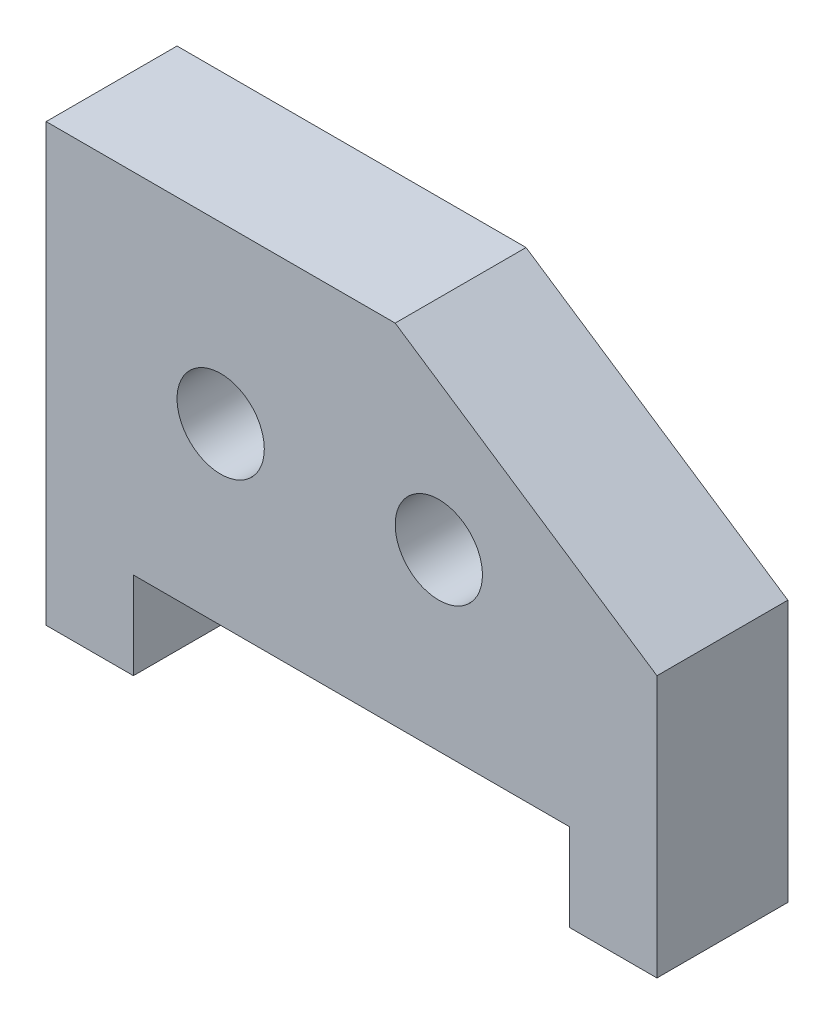
ISO-10303-21;
HEADER;
FILE_DESCRIPTION(('STEP AP214'),'2;1');
FILE_NAME('part.step','',(''),(''),'','','');
FILE_SCHEMA(('AUTOMOTIVE_DESIGN { 1 0 10303 214 1 1 1 1 }'));
ENDSEC;
DATA;
#1=APPLICATION_CONTEXT('core data for automotive mechanical design processes');
#2=APPLICATION_PROTOCOL_DEFINITION('international standard','automotive_design',2000,#1);
#3=PRODUCT_CONTEXT('',#1,'mechanical');
#4=PRODUCT('Part','Part','',(#3));
#5=PRODUCT_RELATED_PRODUCT_CATEGORY('part','',(#4));
#6=PRODUCT_DEFINITION_FORMATION('','',#4);
#7=PRODUCT_DEFINITION_CONTEXT('part definition',#1,'design');
#8=PRODUCT_DEFINITION('design','',#6,#7);
#9=PRODUCT_DEFINITION_SHAPE('','',#8);
#10=(LENGTH_UNIT() NAMED_UNIT(*) SI_UNIT(.MILLI.,.METRE.));
#11=(NAMED_UNIT(*) PLANE_ANGLE_UNIT() SI_UNIT($,.RADIAN.));
#12=(NAMED_UNIT(*) SI_UNIT($,.STERADIAN.) SOLID_ANGLE_UNIT());
#13=UNCERTAINTY_MEASURE_WITH_UNIT(LENGTH_MEASURE(1.E-05),#10,'distance_accuracy_value','');
#14=(GEOMETRIC_REPRESENTATION_CONTEXT(3) GLOBAL_UNCERTAINTY_ASSIGNED_CONTEXT((#13)) GLOBAL_UNIT_ASSIGNED_CONTEXT((#10,
#11,#12)) REPRESENTATION_CONTEXT('',''));
#15=CARTESIAN_POINT('',(0.,0.,0.));
#16=DIRECTION('',(0.,0.,1.));
#17=DIRECTION('',(1.,0.,0.));
#18=AXIS2_PLACEMENT_3D('',#15,#16,#17);
#19=CARTESIAN_POINT('',(0.,0.,75.));
#20=DIRECTION('',(0.,0.,1.));
#21=DIRECTION('',(1.,0.,0.));
#22=AXIS2_PLACEMENT_3D('',#19,#20,#21);
#23=PLANE('',#22);
#24=CARTESIAN_POINT('',(79.1666666666666,4.16666666666664,75.));
#25=DIRECTION('',(0.,0.,1.));
#26=DIRECTION('',(1.,0.,0.));
#27=AXIS2_PLACEMENT_3D('',#24,#25,#26);
#28=CIRCLE('',#27,25.);
#29=CARTESIAN_POINT('',(104.166666666667,4.16666666666664,75.));
#30=VERTEX_POINT('',#29);
#31=EDGE_CURVE('E140',#30,#30,#28,.T.);
#32=ORIENTED_EDGE('',*,*,#31,.F.);
#33=EDGE_LOOP('',(#32));
#34=FACE_BOUND('',#33,.T.);
#35=DIRECTION('',(1.,0.,0.));
#36=VECTOR('',#35,1.);
#37=CARTESIAN_POINT('',(154.166666666667,-145.833333333333,75.));
#38=LINE('',#37,#36);
#39=CARTESIAN_POINT('',(154.166666666667,-145.833333333333,75.));
#40=VERTEX_POINT('',#39);
#41=CARTESIAN_POINT('',(204.166666666667,-145.833333333333,75.));
#42=VERTEX_POINT('',#41);
#43=EDGE_CURVE('E153',#40,#42,#38,.T.);
#44=ORIENTED_EDGE('',*,*,#43,.T.);
#45=DIRECTION('',(0.,1.,0.));
#46=VECTOR('',#45,1.);
#47=CARTESIAN_POINT('',(204.166666666667,-145.833333333333,75.));
#48=LINE('',#47,#46);
#49=CARTESIAN_POINT('',(204.166666666667,4.16666666666668,75.));
#50=VERTEX_POINT('',#49);
#51=EDGE_CURVE('E96',#42,#50,#48,.T.);
#52=ORIENTED_EDGE('',*,*,#51,.T.);
#53=DIRECTION('',(-0.832050294337844,0.554700196225229,0.));
#54=VECTOR('',#53,1.);
#55=CARTESIAN_POINT('',(54.1666666666666,104.166666666667,75.));
#56=LINE('',#55,#54);
#57=CARTESIAN_POINT('',(54.1666666666666,104.166666666667,75.));
#58=VERTEX_POINT('',#57);
#59=EDGE_CURVE('E171',#50,#58,#56,.T.);
#60=ORIENTED_EDGE('',*,*,#59,.T.);
#61=DIRECTION('',(-1.,0.,0.));
#62=VECTOR('',#61,1.);
#63=CARTESIAN_POINT('',(-145.833333333333,104.166666666667,75.));
#64=LINE('',#63,#62);
#65=CARTESIAN_POINT('',(-145.833333333333,104.166666666667,75.));
#66=VERTEX_POINT('',#65);
#67=EDGE_CURVE('E188',#58,#66,#64,.T.);
#68=ORIENTED_EDGE('',*,*,#67,.T.);
#69=DIRECTION('',(0.,-1.,0.));
#70=VECTOR('',#69,1.);
#71=CARTESIAN_POINT('',(-145.833333333333,-145.833333333333,75.));
#72=LINE('',#71,#70);
#73=CARTESIAN_POINT('',(-145.833333333333,-145.833333333333,75.));
#74=VERTEX_POINT('',#73);
#75=EDGE_CURVE('E187',#66,#74,#72,.T.);
#76=ORIENTED_EDGE('',*,*,#75,.T.);
#77=DIRECTION('',(1.,0.,0.));
#78=VECTOR('',#77,1.);
#79=CARTESIAN_POINT('',(-145.833333333333,-145.833333333333,75.));
#80=LINE('',#79,#78);
#81=CARTESIAN_POINT('',(-95.8333333333335,-145.833333333333,75.));
#82=VERTEX_POINT('',#81);
#83=EDGE_CURVE('E118',#74,#82,#80,.T.);
#84=ORIENTED_EDGE('',*,*,#83,.T.);
#85=DIRECTION('',(0.,1.,0.));
#86=VECTOR('',#85,1.);
#87=CARTESIAN_POINT('',(-95.8333333333334,-95.8333333333334,75.));
#88=LINE('',#87,#86);
#89=CARTESIAN_POINT('',(-95.8333333333334,-95.8333333333334,75.));
#90=VERTEX_POINT('',#89);
#91=EDGE_CURVE('E112',#82,#90,#88,.T.);
#92=ORIENTED_EDGE('',*,*,#91,.T.);
#93=DIRECTION('',(1.,0.,0.));
#94=VECTOR('',#93,1.);
#95=CARTESIAN_POINT('',(154.166666666667,-95.8333333333333,75.));
#96=LINE('',#95,#94);
#97=CARTESIAN_POINT('',(154.166666666667,-95.8333333333333,75.));
#98=VERTEX_POINT('',#97);
#99=EDGE_CURVE('E116',#90,#98,#96,.T.);
#100=ORIENTED_EDGE('',*,*,#99,.T.);
#101=DIRECTION('',(0.,-1.,0.));
#102=VECTOR('',#101,1.);
#103=CARTESIAN_POINT('',(154.166666666667,-145.833333333333,75.));
#104=LINE('',#103,#102);
#105=EDGE_CURVE('E50',#98,#40,#104,.T.);
#106=ORIENTED_EDGE('',*,*,#105,.T.);
#107=EDGE_LOOP('',(#44,#52,#60,#68,#76,#84,#92,#100,#106));
#108=FACE_BOUND('',#107,.T.);
#109=CARTESIAN_POINT('',(-45.8333333333334,4.16666666666665,75.));
#110=DIRECTION('',(0.,0.,1.));
#111=DIRECTION('',(1.,0.,0.));
#112=AXIS2_PLACEMENT_3D('',#109,#110,#111);
#113=CIRCLE('',#112,25.);
#114=CARTESIAN_POINT('',(-20.8333333333334,4.16666666666665,75.));
#115=VERTEX_POINT('',#114);
#116=EDGE_CURVE('E198',#115,#115,#113,.T.);
#117=ORIENTED_EDGE('',*,*,#116,.F.);
#118=EDGE_LOOP('',(#117));
#119=FACE_BOUND('',#118,.T.);
#120=ADVANCED_FACE('F33',(#34,#108,#119),#23,.T.);
#121=CARTESIAN_POINT('',(0.,0.,0.));
#122=DIRECTION('',(0.,0.,1.));
#123=DIRECTION('',(1.,0.,0.));
#124=AXIS2_PLACEMENT_3D('',#121,#122,#123);
#125=PLANE('',#124);
#126=DIRECTION('',(1.,0.,0.));
#127=VECTOR('',#126,1.);
#128=CARTESIAN_POINT('',(154.166666666667,-145.833333333333,0.));
#129=LINE('',#128,#127);
#130=CARTESIAN_POINT('',(154.166666666667,-145.833333333333,0.));
#131=VERTEX_POINT('',#130);
#132=CARTESIAN_POINT('',(204.166666666667,-145.833333333333,0.));
#133=VERTEX_POINT('',#132);
#134=EDGE_CURVE('E136',#131,#133,#129,.T.);
#135=ORIENTED_EDGE('',*,*,#134,.F.);
#136=DIRECTION('',(0.,-1.,0.));
#137=VECTOR('',#136,1.);
#138=CARTESIAN_POINT('',(154.166666666667,-145.833333333333,0.));
#139=LINE('',#138,#137);
#140=CARTESIAN_POINT('',(154.166666666667,-95.8333333333333,0.));
#141=VERTEX_POINT('',#140);
#142=EDGE_CURVE('E88',#141,#131,#139,.T.);
#143=ORIENTED_EDGE('',*,*,#142,.F.);
#144=DIRECTION('',(1.,0.,0.));
#145=VECTOR('',#144,1.);
#146=CARTESIAN_POINT('',(154.166666666667,-95.8333333333333,0.));
#147=LINE('',#146,#145);
#148=CARTESIAN_POINT('',(-95.8333333333334,-95.8333333333334,0.));
#149=VERTEX_POINT('',#148);
#150=EDGE_CURVE('E82',#149,#141,#147,.T.);
#151=ORIENTED_EDGE('',*,*,#150,.F.);
#152=DIRECTION('',(0.,1.,0.));
#153=VECTOR('',#152,1.);
#154=CARTESIAN_POINT('',(-95.8333333333334,-95.8333333333334,0.));
#155=LINE('',#154,#153);
#156=CARTESIAN_POINT('',(-95.8333333333335,-145.833333333333,0.));
#157=VERTEX_POINT('',#156);
#158=EDGE_CURVE('E126',#157,#149,#155,.T.);
#159=ORIENTED_EDGE('',*,*,#158,.F.);
#160=DIRECTION('',(1.,0.,0.));
#161=VECTOR('',#160,1.);
#162=CARTESIAN_POINT('',(-145.833333333333,-145.833333333333,0.));
#163=LINE('',#162,#161);
#164=CARTESIAN_POINT('',(-145.833333333333,-145.833333333333,0.));
#165=VERTEX_POINT('',#164);
#166=EDGE_CURVE('E148',#165,#157,#163,.T.);
#167=ORIENTED_EDGE('',*,*,#166,.F.);
#168=DIRECTION('',(0.,-1.,0.));
#169=VECTOR('',#168,1.);
#170=CARTESIAN_POINT('',(-145.833333333333,-145.833333333333,0.));
#171=LINE('',#170,#169);
#172=CARTESIAN_POINT('',(-145.833333333333,104.166666666667,0.));
#173=VERTEX_POINT('',#172);
#174=EDGE_CURVE('E146',#173,#165,#171,.T.);
#175=ORIENTED_EDGE('',*,*,#174,.F.);
#176=DIRECTION('',(-1.,0.,0.));
#177=VECTOR('',#176,1.);
#178=CARTESIAN_POINT('',(-145.833333333333,104.166666666667,0.));
#179=LINE('',#178,#177);
#180=CARTESIAN_POINT('',(54.1666666666666,104.166666666667,0.));
#181=VERTEX_POINT('',#180);
#182=EDGE_CURVE('E144',#181,#173,#179,.T.);
#183=ORIENTED_EDGE('',*,*,#182,.F.);
#184=DIRECTION('',(-0.832050294337844,0.554700196225229,0.));
#185=VECTOR('',#184,1.);
#186=CARTESIAN_POINT('',(54.1666666666666,104.166666666667,0.));
#187=LINE('',#186,#185);
#188=CARTESIAN_POINT('',(204.166666666667,4.16666666666668,0.));
#189=VERTEX_POINT('',#188);
#190=EDGE_CURVE('E142',#189,#181,#187,.T.);
#191=ORIENTED_EDGE('',*,*,#190,.F.);
#192=DIRECTION('',(0.,1.,0.));
#193=VECTOR('',#192,1.);
#194=CARTESIAN_POINT('',(204.166666666667,-145.833333333333,0.));
#195=LINE('',#194,#193);
#196=EDGE_CURVE('E139',#133,#189,#195,.T.);
#197=ORIENTED_EDGE('',*,*,#196,.F.);
#198=EDGE_LOOP('',(#135,#143,#151,#159,#167,#175,#183,#191,#197));
#199=FACE_BOUND('',#198,.T.);
#200=CARTESIAN_POINT('',(79.1666666666666,4.16666666666664,0.));
#201=DIRECTION('',(0.,0.,1.));
#202=DIRECTION('',(1.,0.,0.));
#203=AXIS2_PLACEMENT_3D('',#200,#201,#202);
#204=CIRCLE('',#203,25.);
#205=CARTESIAN_POINT('',(104.166666666667,4.16666666666664,0.));
#206=VERTEX_POINT('',#205);
#207=EDGE_CURVE('E195',#206,#206,#204,.T.);
#208=ORIENTED_EDGE('',*,*,#207,.T.);
#209=EDGE_LOOP('',(#208));
#210=FACE_BOUND('',#209,.T.);
#211=CARTESIAN_POINT('',(-45.8333333333334,4.16666666666665,0.));
#212=DIRECTION('',(0.,0.,1.));
#213=DIRECTION('',(1.,0.,0.));
#214=AXIS2_PLACEMENT_3D('',#211,#212,#213);
#215=CIRCLE('',#214,25.);
#216=CARTESIAN_POINT('',(-20.8333333333334,4.16666666666665,0.));
#217=VERTEX_POINT('',#216);
#218=EDGE_CURVE('E201',#217,#217,#215,.T.);
#219=ORIENTED_EDGE('',*,*,#218,.T.);
#220=EDGE_LOOP('',(#219));
#221=FACE_BOUND('',#220,.T.);
#222=ADVANCED_FACE('F175',(#199,#210,#221),#125,.F.);
#223=CARTESIAN_POINT('',(154.166666666667,-145.833333333333,75.));
#224=DIRECTION('',(0.,1.,0.));
#225=DIRECTION('',(0.,0.,1.));
#226=AXIS2_PLACEMENT_3D('',#223,#224,#225);
#227=PLANE('',#226);
#228=ORIENTED_EDGE('',*,*,#134,.T.);
#229=DIRECTION('',(0.,0.,-1.));
#230=VECTOR('',#229,1.);
#231=CARTESIAN_POINT('',(204.166666666667,-145.833333333333,75.));
#232=LINE('',#231,#230);
#233=EDGE_CURVE('E11',#42,#133,#232,.T.);
#234=ORIENTED_EDGE('',*,*,#233,.F.);
#235=ORIENTED_EDGE('',*,*,#43,.F.);
#236=DIRECTION('',(0.,0.,-1.));
#237=VECTOR('',#236,1.);
#238=CARTESIAN_POINT('',(154.166666666667,-145.833333333333,75.));
#239=LINE('',#238,#237);
#240=EDGE_CURVE('E132',#40,#131,#239,.T.);
#241=ORIENTED_EDGE('',*,*,#240,.T.);
#242=EDGE_LOOP('',(#228,#234,#235,#241));
#243=FACE_BOUND('',#242,.T.);
#244=ADVANCED_FACE('F35',(#243),#227,.F.);
#245=CARTESIAN_POINT('',(204.166666666667,-145.833333333333,75.));
#246=DIRECTION('',(-1.,0.,0.));
#247=DIRECTION('',(0.,0.,1.));
#248=AXIS2_PLACEMENT_3D('',#245,#246,#247);
#249=PLANE('',#248);
#250=ORIENTED_EDGE('',*,*,#196,.T.);
#251=DIRECTION('',(0.,0.,-1.));
#252=VECTOR('',#251,1.);
#253=CARTESIAN_POINT('',(204.166666666667,4.16666666666668,75.));
#254=LINE('',#253,#252);
#255=EDGE_CURVE('E42',#50,#189,#254,.T.);
#256=ORIENTED_EDGE('',*,*,#255,.F.);
#257=ORIENTED_EDGE('',*,*,#51,.F.);
#258=ORIENTED_EDGE('',*,*,#233,.T.);
#259=EDGE_LOOP('',(#250,#256,#257,#258));
#260=FACE_BOUND('',#259,.T.);
#261=ADVANCED_FACE('F237',(#260),#249,.F.);
#262=CARTESIAN_POINT('',(54.1666666666666,104.166666666667,75.));
#263=DIRECTION('',(-0.554700196225229,-0.832050294337844,0.));
#264=DIRECTION('',(0.832050294337844,-0.554700196225229,0.));
#265=AXIS2_PLACEMENT_3D('',#262,#263,#264);
#266=PLANE('',#265);
#267=ORIENTED_EDGE('',*,*,#190,.T.);
#268=DIRECTION('',(0.,0.,-1.));
#269=VECTOR('',#268,1.);
#270=CARTESIAN_POINT('',(54.1666666666666,104.166666666667,75.));
#271=LINE('',#270,#269);
#272=EDGE_CURVE('E163',#58,#181,#271,.T.);
#273=ORIENTED_EDGE('',*,*,#272,.F.);
#274=ORIENTED_EDGE('',*,*,#59,.F.);
#275=ORIENTED_EDGE('',*,*,#255,.T.);
#276=EDGE_LOOP('',(#267,#273,#274,#275));
#277=FACE_BOUND('',#276,.T.);
#278=ADVANCED_FACE('F169',(#277),#266,.F.);
#279=CARTESIAN_POINT('',(-145.833333333333,104.166666666667,75.));
#280=DIRECTION('',(0.,-1.,0.));
#281=DIRECTION('',(0.,0.,-1.));
#282=AXIS2_PLACEMENT_3D('',#279,#280,#281);
#283=PLANE('',#282);
#284=ORIENTED_EDGE('',*,*,#182,.T.);
#285=DIRECTION('',(0.,0.,-1.));
#286=VECTOR('',#285,1.);
#287=CARTESIAN_POINT('',(-145.833333333333,104.166666666667,75.));
#288=LINE('',#287,#286);
#289=EDGE_CURVE('E160',#66,#173,#288,.T.);
#290=ORIENTED_EDGE('',*,*,#289,.F.);
#291=ORIENTED_EDGE('',*,*,#67,.F.);
#292=ORIENTED_EDGE('',*,*,#272,.T.);
#293=EDGE_LOOP('',(#284,#290,#291,#292));
#294=FACE_BOUND('',#293,.T.);
#295=ADVANCED_FACE('F181',(#294),#283,.F.);
#296=CARTESIAN_POINT('',(-145.833333333333,-145.833333333333,75.));
#297=DIRECTION('',(1.,0.,0.));
#298=DIRECTION('',(0.,0.,-1.));
#299=AXIS2_PLACEMENT_3D('',#296,#297,#298);
#300=PLANE('',#299);
#301=ORIENTED_EDGE('',*,*,#174,.T.);
#302=DIRECTION('',(0.,0.,-1.));
#303=VECTOR('',#302,1.);
#304=CARTESIAN_POINT('',(-145.833333333333,-145.833333333333,75.));
#305=LINE('',#304,#303);
#306=EDGE_CURVE('E157',#74,#165,#305,.T.);
#307=ORIENTED_EDGE('',*,*,#306,.F.);
#308=ORIENTED_EDGE('',*,*,#75,.F.);
#309=ORIENTED_EDGE('',*,*,#289,.T.);
#310=EDGE_LOOP('',(#301,#307,#308,#309));
#311=FACE_BOUND('',#310,.T.);
#312=ADVANCED_FACE('F185',(#311),#300,.F.);
#313=CARTESIAN_POINT('',(-145.833333333333,-145.833333333333,75.));
#314=DIRECTION('',(0.,1.,0.));
#315=DIRECTION('',(0.,0.,1.));
#316=AXIS2_PLACEMENT_3D('',#313,#314,#315);
#317=PLANE('',#316);
#318=ORIENTED_EDGE('',*,*,#166,.T.);
#319=DIRECTION('',(0.,0.,-1.));
#320=VECTOR('',#319,1.);
#321=CARTESIAN_POINT('',(-95.8333333333335,-145.833333333333,75.));
#322=LINE('',#321,#320);
#323=EDGE_CURVE('E127',#82,#157,#322,.T.);
#324=ORIENTED_EDGE('',*,*,#323,.F.);
#325=ORIENTED_EDGE('',*,*,#83,.F.);
#326=ORIENTED_EDGE('',*,*,#306,.T.);
#327=EDGE_LOOP('',(#318,#324,#325,#326));
#328=FACE_BOUND('',#327,.T.);
#329=ADVANCED_FACE('F228',(#328),#317,.F.);
#330=CARTESIAN_POINT('',(-95.8333333333334,-95.8333333333334,75.));
#331=DIRECTION('',(-1.,0.,0.));
#332=DIRECTION('',(0.,-1.,0.));
#333=AXIS2_PLACEMENT_3D('',#330,#331,#332);
#334=PLANE('',#333);
#335=ORIENTED_EDGE('',*,*,#158,.T.);
#336=DIRECTION('',(0.,0.,-1.));
#337=VECTOR('',#336,1.);
#338=CARTESIAN_POINT('',(-95.8333333333334,-95.8333333333334,75.));
#339=LINE('',#338,#337);
#340=EDGE_CURVE('E123',#90,#149,#339,.T.);
#341=ORIENTED_EDGE('',*,*,#340,.F.);
#342=ORIENTED_EDGE('',*,*,#91,.F.);
#343=ORIENTED_EDGE('',*,*,#323,.T.);
#344=EDGE_LOOP('',(#335,#341,#342,#343));
#345=FACE_BOUND('',#344,.T.);
#346=ADVANCED_FACE('F124',(#345),#334,.F.);
#347=CARTESIAN_POINT('',(154.166666666667,-95.8333333333333,75.));
#348=DIRECTION('',(0.,1.,0.));
#349=DIRECTION('',(-1.,0.,0.));
#350=AXIS2_PLACEMENT_3D('',#347,#348,#349);
#351=PLANE('',#350);
#352=ORIENTED_EDGE('',*,*,#150,.T.);
#353=DIRECTION('',(0.,0.,-1.));
#354=VECTOR('',#353,1.);
#355=CARTESIAN_POINT('',(154.166666666667,-95.8333333333333,75.));
#356=LINE('',#355,#354);
#357=EDGE_CURVE('E128',#98,#141,#356,.T.);
#358=ORIENTED_EDGE('',*,*,#357,.F.);
#359=ORIENTED_EDGE('',*,*,#99,.F.);
#360=ORIENTED_EDGE('',*,*,#340,.T.);
#361=EDGE_LOOP('',(#352,#358,#359,#360));
#362=FACE_BOUND('',#361,.T.);
#363=ADVANCED_FACE('F130',(#362),#351,.F.);
#364=CARTESIAN_POINT('',(154.166666666667,-145.833333333333,75.));
#365=DIRECTION('',(1.,0.,0.));
#366=DIRECTION('',(0.,0.,-1.));
#367=AXIS2_PLACEMENT_3D('',#364,#365,#366);
#368=PLANE('',#367);
#369=ORIENTED_EDGE('',*,*,#142,.T.);
#370=ORIENTED_EDGE('',*,*,#240,.F.);
#371=ORIENTED_EDGE('',*,*,#105,.F.);
#372=ORIENTED_EDGE('',*,*,#357,.T.);
#373=EDGE_LOOP('',(#369,#370,#371,#372));
#374=FACE_BOUND('',#373,.T.);
#375=ADVANCED_FACE('F221',(#374),#368,.F.);
#376=CARTESIAN_POINT('',(79.1666666666666,4.16666666666664,75.));
#377=DIRECTION('',(0.,0.,-1.));
#378=DIRECTION('',(-1.,0.,0.));
#379=AXIS2_PLACEMENT_3D('',#376,#377,#378);
#380=CYLINDRICAL_SURFACE('',#379,25.);
#381=ORIENTED_EDGE('',*,*,#31,.T.);
#382=EDGE_LOOP('',(#381));
#383=FACE_BOUND('',#382,.T.);
#384=ORIENTED_EDGE('',*,*,#207,.F.);
#385=EDGE_LOOP('',(#384));
#386=FACE_BOUND('',#385,.T.);
#387=ADVANCED_FACE('F218',(#383,#386),#380,.F.);
#388=CARTESIAN_POINT('',(-45.8333333333334,4.16666666666665,75.));
#389=DIRECTION('',(0.,0.,-1.));
#390=DIRECTION('',(-1.,0.,0.));
#391=AXIS2_PLACEMENT_3D('',#388,#389,#390);
#392=CYLINDRICAL_SURFACE('',#391,25.);
#393=ORIENTED_EDGE('',*,*,#116,.T.);
#394=EDGE_LOOP('',(#393));
#395=FACE_BOUND('',#394,.T.);
#396=ORIENTED_EDGE('',*,*,#218,.F.);
#397=EDGE_LOOP('',(#396));
#398=FACE_BOUND('',#397,.T.);
#399=ADVANCED_FACE('F207',(#395,#398),#392,.F.);
#400=CLOSED_SHELL('',(#120,#222,#244,#261,#278,#295,#312,#329,#346,#363,#375,#387,#399));
#401=MANIFOLD_SOLID_BREP('B2',#400);
#402=ADVANCED_BREP_SHAPE_REPRESENTATION('',(#18,#401),#14);
#403=SHAPE_DEFINITION_REPRESENTATION(#9,#402);
ENDSEC;
END-ISO-10303-21;
